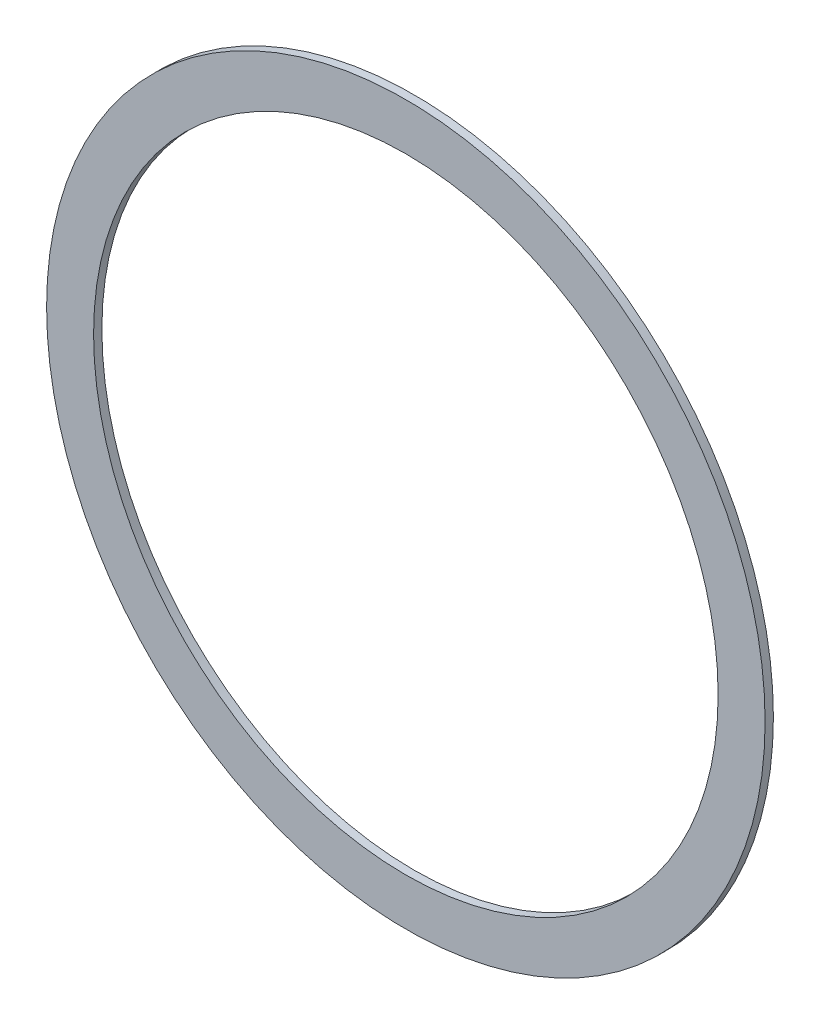
ISO-10303-21;
HEADER;
FILE_DESCRIPTION(('STEP AP214'),'2;1');
FILE_NAME('part.step','',(''),(''),'','','');
FILE_SCHEMA(('AUTOMOTIVE_DESIGN { 1 0 10303 214 1 1 1 1 }'));
ENDSEC;
DATA;
#1=APPLICATION_CONTEXT('core data for automotive mechanical design processes');
#2=APPLICATION_PROTOCOL_DEFINITION('international standard','automotive_design',2000,#1);
#3=PRODUCT_CONTEXT('',#1,'mechanical');
#4=PRODUCT('Part','Part','',(#3));
#5=PRODUCT_RELATED_PRODUCT_CATEGORY('part','',(#4));
#6=PRODUCT_DEFINITION_FORMATION('','',#4);
#7=PRODUCT_DEFINITION_CONTEXT('part definition',#1,'design');
#8=PRODUCT_DEFINITION('design','',#6,#7);
#9=PRODUCT_DEFINITION_SHAPE('','',#8);
#10=(LENGTH_UNIT() NAMED_UNIT(*) SI_UNIT(.MILLI.,.METRE.));
#11=(NAMED_UNIT(*) PLANE_ANGLE_UNIT() SI_UNIT($,.RADIAN.));
#12=(NAMED_UNIT(*) SI_UNIT($,.STERADIAN.) SOLID_ANGLE_UNIT());
#13=UNCERTAINTY_MEASURE_WITH_UNIT(LENGTH_MEASURE(1.E-05),#10,'distance_accuracy_value','');
#14=(GEOMETRIC_REPRESENTATION_CONTEXT(3) GLOBAL_UNCERTAINTY_ASSIGNED_CONTEXT((#13)) GLOBAL_UNIT_ASSIGNED_CONTEXT((#10,
#11,#12)) REPRESENTATION_CONTEXT('',''));
#15=CARTESIAN_POINT('',(0.,0.,0.));
#16=DIRECTION('',(0.,0.,1.));
#17=DIRECTION('',(1.,0.,0.));
#18=AXIS2_PLACEMENT_3D('',#15,#16,#17);
#19=CARTESIAN_POINT('',(0.,0.,13.));
#20=DIRECTION('',(0.,0.,1.));
#21=DIRECTION('',(1.,0.,0.));
#22=AXIS2_PLACEMENT_3D('',#19,#20,#21);
#23=PLANE('',#22);
#24=CARTESIAN_POINT('',(0.,0.,13.));
#25=DIRECTION('',(0.,0.,1.));
#26=DIRECTION('',(1.,0.,0.));
#27=AXIS2_PLACEMENT_3D('',#24,#25,#26);
#28=CIRCLE('',#27,65.);
#29=CARTESIAN_POINT('',(65.,0.,13.));
#30=VERTEX_POINT('',#29);
#31=EDGE_CURVE('E10',#30,#30,#28,.T.);
#32=ORIENTED_EDGE('',*,*,#31,.T.);
#33=EDGE_LOOP('',(#32));
#34=FACE_BOUND('',#33,.T.);
#35=CARTESIAN_POINT('',(0.,0.,13.));
#36=DIRECTION('',(0.,0.,1.));
#37=DIRECTION('',(1.,0.,0.));
#38=AXIS2_PLACEMENT_3D('',#35,#36,#37);
#39=CIRCLE('',#38,56.5);
#40=CARTESIAN_POINT('',(56.5,0.,13.));
#41=VERTEX_POINT('',#40);
#42=EDGE_CURVE('E42',#41,#41,#39,.T.);
#43=ORIENTED_EDGE('',*,*,#42,.F.);
#44=EDGE_LOOP('',(#43));
#45=FACE_BOUND('',#44,.T.);
#46=ADVANCED_FACE('F31',(#34,#45),#23,.T.);
#47=CARTESIAN_POINT('',(0.,0.,11.5));
#48=DIRECTION('',(0.,0.,1.));
#49=DIRECTION('',(1.,0.,0.));
#50=AXIS2_PLACEMENT_3D('',#47,#48,#49);
#51=PLANE('',#50);
#52=CARTESIAN_POINT('',(0.,0.,11.5));
#53=DIRECTION('',(0.,0.,1.));
#54=DIRECTION('',(1.,0.,0.));
#55=AXIS2_PLACEMENT_3D('',#52,#53,#54);
#56=CIRCLE('',#55,65.);
#57=CARTESIAN_POINT('',(65.,0.,11.5));
#58=VERTEX_POINT('',#57);
#59=EDGE_CURVE('E35',#58,#58,#56,.T.);
#60=ORIENTED_EDGE('',*,*,#59,.F.);
#61=EDGE_LOOP('',(#60));
#62=FACE_BOUND('',#61,.T.);
#63=CARTESIAN_POINT('',(0.,0.,11.5));
#64=DIRECTION('',(0.,0.,1.));
#65=DIRECTION('',(1.,0.,0.));
#66=AXIS2_PLACEMENT_3D('',#63,#64,#65);
#67=CIRCLE('',#66,56.5);
#68=CARTESIAN_POINT('',(56.5,0.,11.5));
#69=VERTEX_POINT('',#68);
#70=EDGE_CURVE('E44',#69,#69,#67,.T.);
#71=ORIENTED_EDGE('',*,*,#70,.T.);
#72=EDGE_LOOP('',(#71));
#73=FACE_BOUND('',#72,.T.);
#74=ADVANCED_FACE('F54',(#62,#73),#51,.F.);
#75=CARTESIAN_POINT('',(0.,0.,13.));
#76=DIRECTION('',(0.,0.,-1.));
#77=DIRECTION('',(-1.,0.,0.));
#78=AXIS2_PLACEMENT_3D('',#75,#76,#77);
#79=CYLINDRICAL_SURFACE('',#78,65.);
#80=ORIENTED_EDGE('',*,*,#31,.F.);
#81=EDGE_LOOP('',(#80));
#82=FACE_BOUND('',#81,.T.);
#83=ORIENTED_EDGE('',*,*,#59,.T.);
#84=EDGE_LOOP('',(#83));
#85=FACE_BOUND('',#84,.T.);
#86=ADVANCED_FACE('F33',(#82,#85),#79,.T.);
#87=CARTESIAN_POINT('',(0.,0.,13.));
#88=DIRECTION('',(0.,0.,-1.));
#89=DIRECTION('',(-1.,0.,0.));
#90=AXIS2_PLACEMENT_3D('',#87,#88,#89);
#91=CYLINDRICAL_SURFACE('',#90,56.5);
#92=ORIENTED_EDGE('',*,*,#42,.T.);
#93=EDGE_LOOP('',(#92));
#94=FACE_BOUND('',#93,.T.);
#95=ORIENTED_EDGE('',*,*,#70,.F.);
#96=EDGE_LOOP('',(#95));
#97=FACE_BOUND('',#96,.T.);
#98=ADVANCED_FACE('F50',(#94,#97),#91,.F.);
#99=CLOSED_SHELL('',(#46,#74,#86,#98));
#100=MANIFOLD_SOLID_BREP('B2',#99);
#101=ADVANCED_BREP_SHAPE_REPRESENTATION('',(#18,#100),#14);
#102=SHAPE_DEFINITION_REPRESENTATION(#9,#101);
ENDSEC;
END-ISO-10303-21;
